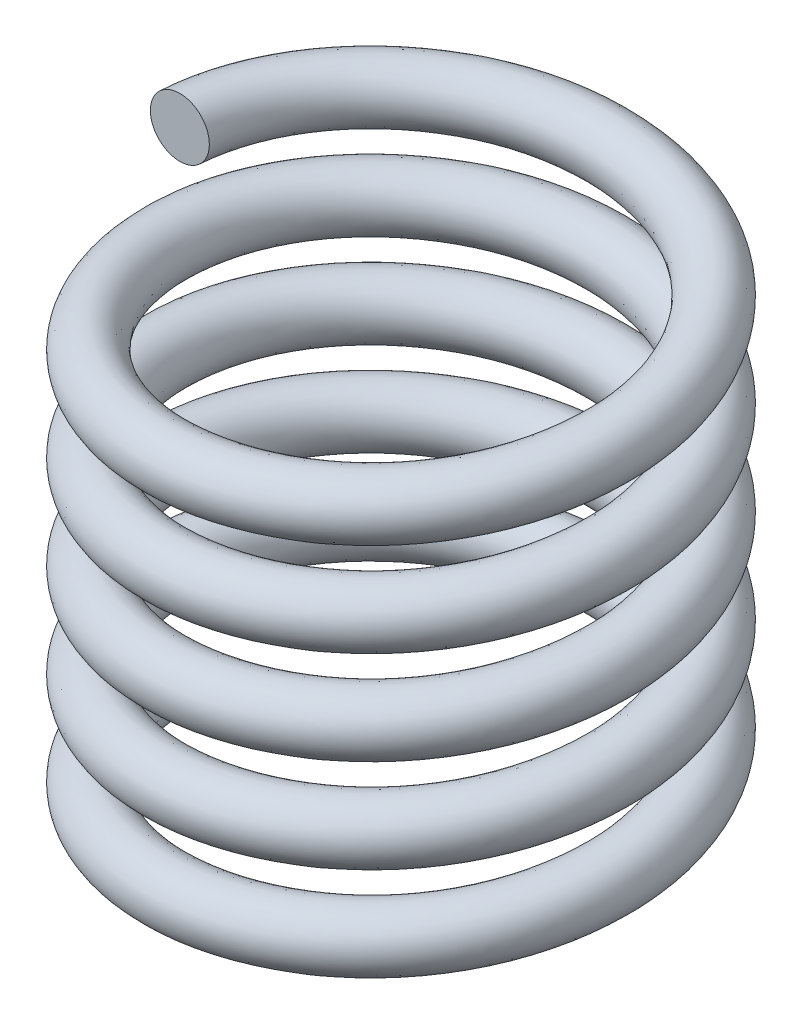
ISO-10303-21;
HEADER;
FILE_DESCRIPTION(('STEP AP214'),'2;1');
FILE_NAME('part.step','',(''),(''),'','','');
FILE_SCHEMA(('AUTOMOTIVE_DESIGN { 1 0 10303 214 1 1 1 1 }'));
ENDSEC;
DATA;
#1=APPLICATION_CONTEXT('core data for automotive mechanical design processes');
#2=APPLICATION_PROTOCOL_DEFINITION('international standard','automotive_design',2000,#1);
#3=PRODUCT_CONTEXT('',#1,'mechanical');
#4=PRODUCT('Part','Part','',(#3));
#5=PRODUCT_RELATED_PRODUCT_CATEGORY('part','',(#4));
#6=PRODUCT_DEFINITION_FORMATION('','',#4);
#7=PRODUCT_DEFINITION_CONTEXT('part definition',#1,'design');
#8=PRODUCT_DEFINITION('design','',#6,#7);
#9=PRODUCT_DEFINITION_SHAPE('','',#8);
#10=(LENGTH_UNIT() NAMED_UNIT(*) SI_UNIT(.MILLI.,.METRE.));
#11=(NAMED_UNIT(*) PLANE_ANGLE_UNIT() SI_UNIT($,.RADIAN.));
#12=(NAMED_UNIT(*) SI_UNIT($,.STERADIAN.) SOLID_ANGLE_UNIT());
#13=UNCERTAINTY_MEASURE_WITH_UNIT(LENGTH_MEASURE(1.E-05),#10,'distance_accuracy_value','');
#14=(GEOMETRIC_REPRESENTATION_CONTEXT(3) GLOBAL_UNCERTAINTY_ASSIGNED_CONTEXT((#13)) GLOBAL_UNIT_ASSIGNED_CONTEXT((#10,
#11,#12)) REPRESENTATION_CONTEXT('',''));
#15=CARTESIAN_POINT('',(0.,0.,0.));
#16=DIRECTION('',(0.,0.,1.));
#17=DIRECTION('',(1.,0.,0.));
#18=AXIS2_PLACEMENT_3D('',#15,#16,#17);
#19=CARTESIAN_POINT('',(-3.,0.,0.));
#20=DIRECTION('',(0.,0.,1.));
#21=DIRECTION('',(1.,0.,0.));
#22=AXIS2_PLACEMENT_3D('',#19,#20,#21);
#23=PLANE('',#22);
#24=CARTESIAN_POINT('',(-3.,0.,0.));
#25=DIRECTION('',(0.,0.,1.));
#26=DIRECTION('',(1.,0.,0.));
#27=AXIS2_PLACEMENT_3D('',#24,#25,#26);
#28=CIRCLE('',#27,0.4);
#29=CARTESIAN_POINT('',(-2.6,0.,0.));
#30=VERTEX_POINT('',#29);
#31=EDGE_CURVE('E40',#30,#30,#28,.T.);
#32=ORIENTED_EDGE('',*,*,#31,.F.);
#33=EDGE_LOOP('',(#32));
#34=FACE_BOUND('',#33,.T.);
#35=ADVANCED_FACE('F33',(#34),#23,.F.);
#36=CARTESIAN_POINT('',(-3.,6.35,2.09488880330588E-13));
#37=DIRECTION('',(0.,0.,1.));
#38=DIRECTION('',(1.,0.,0.));
#39=AXIS2_PLACEMENT_3D('',#36,#37,#38);
#40=PLANE('',#39);
#41=CARTESIAN_POINT('',(-3.,6.35,2.09488880330588E-13));
#42=DIRECTION('',(0.,0.,1.));
#43=DIRECTION('',(1.,0.,0.));
#44=AXIS2_PLACEMENT_3D('',#41,#42,#43);
#45=CIRCLE('',#44,0.4);
#46=CARTESIAN_POINT('',(-2.6,6.35,1.81557029619843E-13));
#47=VERTEX_POINT('',#46);
#48=EDGE_CURVE('E11',#47,#47,#45,.T.);
#49=ORIENTED_EDGE('',*,*,#48,.T.);
#50=EDGE_LOOP('',(#49));
#51=FACE_BOUND('',#50,.T.);
#52=ADVANCED_FACE('F47',(#51),#40,.T.);
#53=CARTESIAN_POINT('',(-2.6,0.,0.));
#54=CARTESIAN_POINT('',(-2.6,0.105833333333333,1.50111069989303));
#55=CARTESIAN_POINT('',(-1.3,0.211666666666666,2.25166604983954));
#56=CARTESIAN_POINT('',(0.,0.317499999999999,3.00222139978605));
#57=CARTESIAN_POINT('',(1.3,0.423333333333332,2.25166604983954));
#58=CARTESIAN_POINT('',(2.6,0.529166666666665,1.50111069989303));
#59=CARTESIAN_POINT('',(2.6,0.634999999999998,0.));
#60=CARTESIAN_POINT('',(2.6,0.740833333333331,-1.50111069989303));
#61=CARTESIAN_POINT('',(1.3,0.846666666666664,-2.25166604983954));
#62=CARTESIAN_POINT('',(0.,0.952499999999997,-3.00222139978605));
#63=CARTESIAN_POINT('',(-1.3,1.05833333333333,-2.25166604983954));
#64=CARTESIAN_POINT('',(-2.6,1.16416666666666,-1.50111069989303));
#65=CARTESIAN_POINT('',(-2.6,1.27,0.));
#66=CARTESIAN_POINT('',(-2.6,1.37583333333333,1.50111069989303));
#67=CARTESIAN_POINT('',(-1.3,1.48166666666666,2.25166604983954));
#68=CARTESIAN_POINT('',(0.,1.5875,3.00222139978605));
#69=CARTESIAN_POINT('',(1.3,1.69333333333333,2.25166604983954));
#70=CARTESIAN_POINT('',(2.6,1.79916666666666,1.50111069989303));
#71=CARTESIAN_POINT('',(2.6,1.90499999999999,0.));
#72=CARTESIAN_POINT('',(2.6,2.01083333333333,-1.50111069989303));
#73=CARTESIAN_POINT('',(1.3,2.11666666666666,-2.25166604983954));
#74=CARTESIAN_POINT('',(0.,2.22249999999999,-3.00222139978605));
#75=CARTESIAN_POINT('',(-1.3,2.32833333333333,-2.25166604983954));
#76=CARTESIAN_POINT('',(-2.6,2.43416666666666,-1.50111069989303));
#77=CARTESIAN_POINT('',(-2.6,2.53999999999999,0.));
#78=CARTESIAN_POINT('',(-2.6,2.64583333333333,1.50111069989303));
#79=CARTESIAN_POINT('',(-1.3,2.75166666666666,2.25166604983954));
#80=CARTESIAN_POINT('',(0.,2.85749999999999,3.00222139978605));
#81=CARTESIAN_POINT('',(1.3,2.96333333333333,2.25166604983954));
#82=CARTESIAN_POINT('',(2.6,3.06916666666666,1.50111069989303));
#83=CARTESIAN_POINT('',(2.6,3.17499999999999,0.));
#84=CARTESIAN_POINT('',(2.6,3.28083333333332,-1.50111069989303));
#85=CARTESIAN_POINT('',(1.3,3.38666666666666,-2.25166604983954));
#86=CARTESIAN_POINT('',(0.,3.49249999999999,-3.00222139978605));
#87=CARTESIAN_POINT('',(-1.3,3.59833333333332,-2.25166604983954));
#88=CARTESIAN_POINT('',(-2.6,3.70416666666666,-1.50111069989303));
#89=CARTESIAN_POINT('',(-2.6,3.80999999999999,0.));
#90=CARTESIAN_POINT('',(-2.6,3.91583333333332,1.50111069989303));
#91=CARTESIAN_POINT('',(-1.3,4.02166666666665,2.25166604983954));
#92=CARTESIAN_POINT('',(0.,4.12749999999999,3.00222139978605));
#93=CARTESIAN_POINT('',(1.3,4.23333333333332,2.25166604983954));
#94=CARTESIAN_POINT('',(2.6,4.33916666666665,1.50111069989303));
#95=CARTESIAN_POINT('',(2.6,4.44499999999999,0.));
#96=CARTESIAN_POINT('',(2.6,4.55083333333332,-1.50111069989303));
#97=CARTESIAN_POINT('',(1.3,4.65666666666665,-2.25166604983954));
#98=CARTESIAN_POINT('',(0.,4.76249999999999,-3.00222139978605));
#99=CARTESIAN_POINT('',(-1.3,4.86833333333332,-2.25166604983954));
#100=CARTESIAN_POINT('',(-2.6,4.97416666666665,-1.50111069989303));
#101=CARTESIAN_POINT('',(-2.6,5.07999999999999,0.));
#102=CARTESIAN_POINT('',(-2.6,5.18583333333332,1.50111069989303));
#103=CARTESIAN_POINT('',(-1.3,5.29166666666665,2.25166604983954));
#104=CARTESIAN_POINT('',(0.,5.39749999999999,3.00222139978605));
#105=CARTESIAN_POINT('',(1.3,5.50333333333332,2.25166604983954));
#106=CARTESIAN_POINT('',(2.6,5.60916666666665,1.50111069989303));
#107=CARTESIAN_POINT('',(2.6,5.71499999999998,0.));
#108=CARTESIAN_POINT('',(2.6,5.82083333333332,-1.50111069989303));
#109=CARTESIAN_POINT('',(1.3,5.92666666666665,-2.25166604983954));
#110=CARTESIAN_POINT('',(0.,6.03249999999998,-3.00222139978605));
#111=CARTESIAN_POINT('',(-1.3,6.13833333333332,-2.25166604983954));
#112=CARTESIAN_POINT('',(-2.6,6.24416666666665,-1.50111069989303));
#113=CARTESIAN_POINT('',(-2.6,6.34999999999998,0.));
#114=CARTESIAN_POINT('',(-2.6,0.800000000000001,0.));
#115=CARTESIAN_POINT('',(-2.6,0.905833333333334,1.50111069989303));
#116=CARTESIAN_POINT('',(-1.3,1.01166666666667,2.25166604983954));
#117=CARTESIAN_POINT('',(0.,1.1175,3.00222139978605));
#118=CARTESIAN_POINT('',(1.3,1.22333333333333,2.25166604983954));
#119=CARTESIAN_POINT('',(2.6,1.32916666666667,1.50111069989303));
#120=CARTESIAN_POINT('',(2.6,1.435,0.));
#121=CARTESIAN_POINT('',(2.6,1.54083333333333,-1.50111069989303));
#122=CARTESIAN_POINT('',(1.3,1.64666666666666,-2.25166604983954));
#123=CARTESIAN_POINT('',(0.,1.7525,-3.00222139978605));
#124=CARTESIAN_POINT('',(-1.3,1.85833333333333,-2.25166604983954));
#125=CARTESIAN_POINT('',(-2.6,1.96416666666666,-1.50111069989303));
#126=CARTESIAN_POINT('',(-2.6,2.07,0.));
#127=CARTESIAN_POINT('',(-2.6,2.17583333333333,1.50111069989303));
#128=CARTESIAN_POINT('',(-1.3,2.28166666666666,2.25166604983954));
#129=CARTESIAN_POINT('',(0.,2.3875,3.00222139978605));
#130=CARTESIAN_POINT('',(1.3,2.49333333333333,2.25166604983954));
#131=CARTESIAN_POINT('',(2.6,2.59916666666666,1.50111069989303));
#132=CARTESIAN_POINT('',(2.6,2.705,0.));
#133=CARTESIAN_POINT('',(2.6,2.81083333333333,-1.50111069989303));
#134=CARTESIAN_POINT('',(1.3,2.91666666666666,-2.25166604983954));
#135=CARTESIAN_POINT('',(0.,3.0225,-3.00222139978605));
#136=CARTESIAN_POINT('',(-1.3,3.12833333333333,-2.25166604983954));
#137=CARTESIAN_POINT('',(-2.6,3.23416666666666,-1.50111069989303));
#138=CARTESIAN_POINT('',(-2.6,3.33999999999999,0.));
#139=CARTESIAN_POINT('',(-2.6,3.44583333333333,1.50111069989303));
#140=CARTESIAN_POINT('',(-1.3,3.55166666666666,2.25166604983954));
#141=CARTESIAN_POINT('',(0.,3.65749999999999,3.00222139978605));
#142=CARTESIAN_POINT('',(1.3,3.76333333333333,2.25166604983954));
#143=CARTESIAN_POINT('',(2.6,3.86916666666666,1.50111069989303));
#144=CARTESIAN_POINT('',(2.6,3.97499999999999,0.));
#145=CARTESIAN_POINT('',(2.6,4.08083333333333,-1.50111069989303));
#146=CARTESIAN_POINT('',(1.3,4.18666666666666,-2.25166604983954));
#147=CARTESIAN_POINT('',(0.,4.29249999999999,-3.00222139978605));
#148=CARTESIAN_POINT('',(-1.3,4.39833333333332,-2.25166604983954));
#149=CARTESIAN_POINT('',(-2.6,4.50416666666666,-1.50111069989303));
#150=CARTESIAN_POINT('',(-2.6,4.60999999999999,0.));
#151=CARTESIAN_POINT('',(-2.6,4.71583333333332,1.50111069989303));
#152=CARTESIAN_POINT('',(-1.3,4.82166666666666,2.25166604983954));
#153=CARTESIAN_POINT('',(0.,4.92749999999999,3.00222139978605));
#154=CARTESIAN_POINT('',(1.3,5.03333333333332,2.25166604983954));
#155=CARTESIAN_POINT('',(2.6,5.13916666666666,1.50111069989303));
#156=CARTESIAN_POINT('',(2.6,5.24499999999999,0.));
#157=CARTESIAN_POINT('',(2.6,5.35083333333332,-1.50111069989303));
#158=CARTESIAN_POINT('',(1.3,5.45666666666665,-2.25166604983954));
#159=CARTESIAN_POINT('',(0.,5.56249999999999,-3.00222139978605));
#160=CARTESIAN_POINT('',(-1.3,5.66833333333332,-2.25166604983954));
#161=CARTESIAN_POINT('',(-2.6,5.77416666666665,-1.50111069989303));
#162=CARTESIAN_POINT('',(-2.6,5.87999999999999,0.));
#163=CARTESIAN_POINT('',(-2.6,5.98583333333332,1.50111069989303));
#164=CARTESIAN_POINT('',(-1.3,6.09166666666665,2.25166604983954));
#165=CARTESIAN_POINT('',(0.,6.19749999999999,3.00222139978605));
#166=CARTESIAN_POINT('',(1.3,6.30333333333332,2.25166604983954));
#167=CARTESIAN_POINT('',(2.6,6.40916666666665,1.50111069989303));
#168=CARTESIAN_POINT('',(2.6,6.51499999999999,0.));
#169=CARTESIAN_POINT('',(2.6,6.62083333333332,-1.50111069989303));
#170=CARTESIAN_POINT('',(1.3,6.72666666666665,-2.25166604983954));
#171=CARTESIAN_POINT('',(0.,6.83249999999999,-3.00222139978605));
#172=CARTESIAN_POINT('',(-1.3,6.93833333333332,-2.25166604983954));
#173=CARTESIAN_POINT('',(-2.6,7.04416666666665,-1.50111069989303));
#174=CARTESIAN_POINT('',(-2.6,7.14999999999998,0.));
#175=CARTESIAN_POINT('',(-3.4,0.800000000000001,0.));
#176=CARTESIAN_POINT('',(-3.4,0.905833333333334,1.96299091524473));
#177=CARTESIAN_POINT('',(-1.7,1.01166666666667,2.94448637286709));
#178=CARTESIAN_POINT('',(0.,1.1175,3.92598183048946));
#179=CARTESIAN_POINT('',(1.7,1.22333333333333,2.94448637286709));
#180=CARTESIAN_POINT('',(3.4,1.32916666666667,1.96299091524473));
#181=CARTESIAN_POINT('',(3.4,1.435,0.));
#182=CARTESIAN_POINT('',(3.4,1.54083333333333,-1.96299091524473));
#183=CARTESIAN_POINT('',(1.7,1.64666666666666,-2.94448637286709));
#184=CARTESIAN_POINT('',(0.,1.7525,-3.92598183048946));
#185=CARTESIAN_POINT('',(-1.7,1.85833333333333,-2.94448637286709));
#186=CARTESIAN_POINT('',(-3.4,1.96416666666666,-1.96299091524473));
#187=CARTESIAN_POINT('',(-3.4,2.07,0.));
#188=CARTESIAN_POINT('',(-3.4,2.17583333333333,1.96299091524473));
#189=CARTESIAN_POINT('',(-1.7,2.28166666666666,2.94448637286709));
#190=CARTESIAN_POINT('',(0.,2.3875,3.92598183048946));
#191=CARTESIAN_POINT('',(1.7,2.49333333333333,2.94448637286709));
#192=CARTESIAN_POINT('',(3.4,2.59916666666666,1.96299091524473));
#193=CARTESIAN_POINT('',(3.4,2.705,0.));
#194=CARTESIAN_POINT('',(3.4,2.81083333333333,-1.96299091524473));
#195=CARTESIAN_POINT('',(1.7,2.91666666666666,-2.94448637286709));
#196=CARTESIAN_POINT('',(0.,3.0225,-3.92598183048946));
#197=CARTESIAN_POINT('',(-1.7,3.12833333333333,-2.94448637286709));
#198=CARTESIAN_POINT('',(-3.4,3.23416666666666,-1.96299091524473));
#199=CARTESIAN_POINT('',(-3.4,3.33999999999999,0.));
#200=CARTESIAN_POINT('',(-3.4,3.44583333333333,1.96299091524473));
#201=CARTESIAN_POINT('',(-1.7,3.55166666666666,2.94448637286709));
#202=CARTESIAN_POINT('',(0.,3.65749999999999,3.92598183048946));
#203=CARTESIAN_POINT('',(1.7,3.76333333333333,2.94448637286709));
#204=CARTESIAN_POINT('',(3.4,3.86916666666666,1.96299091524473));
#205=CARTESIAN_POINT('',(3.4,3.97499999999999,0.));
#206=CARTESIAN_POINT('',(3.4,4.08083333333333,-1.96299091524473));
#207=CARTESIAN_POINT('',(1.7,4.18666666666666,-2.94448637286709));
#208=CARTESIAN_POINT('',(0.,4.29249999999999,-3.92598183048946));
#209=CARTESIAN_POINT('',(-1.7,4.39833333333332,-2.94448637286709));
#210=CARTESIAN_POINT('',(-3.4,4.50416666666666,-1.96299091524473));
#211=CARTESIAN_POINT('',(-3.4,4.60999999999999,0.));
#212=CARTESIAN_POINT('',(-3.4,4.71583333333332,1.96299091524473));
#213=CARTESIAN_POINT('',(-1.7,4.82166666666666,2.94448637286709));
#214=CARTESIAN_POINT('',(0.,4.92749999999999,3.92598183048946));
#215=CARTESIAN_POINT('',(1.7,5.03333333333332,2.94448637286709));
#216=CARTESIAN_POINT('',(3.4,5.13916666666666,1.96299091524473));
#217=CARTESIAN_POINT('',(3.4,5.24499999999999,0.));
#218=CARTESIAN_POINT('',(3.4,5.35083333333332,-1.96299091524473));
#219=CARTESIAN_POINT('',(1.7,5.45666666666665,-2.94448637286709));
#220=CARTESIAN_POINT('',(0.,5.56249999999999,-3.92598183048946));
#221=CARTESIAN_POINT('',(-1.7,5.66833333333332,-2.94448637286709));
#222=CARTESIAN_POINT('',(-3.4,5.77416666666665,-1.96299091524473));
#223=CARTESIAN_POINT('',(-3.4,5.87999999999999,0.));
#224=CARTESIAN_POINT('',(-3.4,5.98583333333332,1.96299091524473));
#225=CARTESIAN_POINT('',(-1.7,6.09166666666665,2.94448637286709));
#226=CARTESIAN_POINT('',(0.,6.19749999999999,3.92598183048946));
#227=CARTESIAN_POINT('',(1.7,6.30333333333332,2.94448637286709));
#228=CARTESIAN_POINT('',(3.4,6.40916666666665,1.96299091524473));
#229=CARTESIAN_POINT('',(3.4,6.51499999999999,0.));
#230=CARTESIAN_POINT('',(3.4,6.62083333333332,-1.96299091524473));
#231=CARTESIAN_POINT('',(1.7,6.72666666666665,-2.94448637286709));
#232=CARTESIAN_POINT('',(0.,6.83249999999999,-3.92598183048946));
#233=CARTESIAN_POINT('',(-1.7,6.93833333333332,-2.94448637286709));
#234=CARTESIAN_POINT('',(-3.4,7.04416666666665,-1.96299091524473));
#235=CARTESIAN_POINT('',(-3.4,7.14999999999998,0.));
#236=CARTESIAN_POINT('',(-3.4,0.,0.));
#237=CARTESIAN_POINT('',(-3.4,0.105833333333333,1.96299091524473));
#238=CARTESIAN_POINT('',(-1.7,0.211666666666666,2.94448637286709));
#239=CARTESIAN_POINT('',(0.,0.317499999999999,3.92598183048946));
#240=CARTESIAN_POINT('',(1.7,0.423333333333332,2.94448637286709));
#241=CARTESIAN_POINT('',(3.4,0.529166666666665,1.96299091524473));
#242=CARTESIAN_POINT('',(3.4,0.634999999999998,0.));
#243=CARTESIAN_POINT('',(3.4,0.740833333333331,-1.96299091524473));
#244=CARTESIAN_POINT('',(1.7,0.846666666666664,-2.94448637286709));
#245=CARTESIAN_POINT('',(0.,0.952499999999997,-3.92598183048946));
#246=CARTESIAN_POINT('',(-1.7,1.05833333333333,-2.94448637286709));
#247=CARTESIAN_POINT('',(-3.4,1.16416666666666,-1.96299091524473));
#248=CARTESIAN_POINT('',(-3.4,1.27,0.));
#249=CARTESIAN_POINT('',(-3.4,1.37583333333333,1.96299091524473));
#250=CARTESIAN_POINT('',(-1.7,1.48166666666666,2.94448637286709));
#251=CARTESIAN_POINT('',(0.,1.5875,3.92598183048946));
#252=CARTESIAN_POINT('',(1.7,1.69333333333333,2.94448637286709));
#253=CARTESIAN_POINT('',(3.4,1.79916666666666,1.96299091524473));
#254=CARTESIAN_POINT('',(3.4,1.90499999999999,0.));
#255=CARTESIAN_POINT('',(3.4,2.01083333333333,-1.96299091524473));
#256=CARTESIAN_POINT('',(1.7,2.11666666666666,-2.94448637286709));
#257=CARTESIAN_POINT('',(0.,2.22249999999999,-3.92598183048946));
#258=CARTESIAN_POINT('',(-1.7,2.32833333333333,-2.94448637286709));
#259=CARTESIAN_POINT('',(-3.4,2.43416666666666,-1.96299091524473));
#260=CARTESIAN_POINT('',(-3.4,2.53999999999999,0.));
#261=CARTESIAN_POINT('',(-3.4,2.64583333333333,1.96299091524473));
#262=CARTESIAN_POINT('',(-1.7,2.75166666666666,2.94448637286709));
#263=CARTESIAN_POINT('',(0.,2.85749999999999,3.92598183048946));
#264=CARTESIAN_POINT('',(1.7,2.96333333333333,2.94448637286709));
#265=CARTESIAN_POINT('',(3.4,3.06916666666666,1.96299091524473));
#266=CARTESIAN_POINT('',(3.4,3.17499999999999,0.));
#267=CARTESIAN_POINT('',(3.4,3.28083333333332,-1.96299091524473));
#268=CARTESIAN_POINT('',(1.7,3.38666666666666,-2.94448637286709));
#269=CARTESIAN_POINT('',(0.,3.49249999999999,-3.92598183048946));
#270=CARTESIAN_POINT('',(-1.7,3.59833333333332,-2.94448637286709));
#271=CARTESIAN_POINT('',(-3.4,3.70416666666666,-1.96299091524473));
#272=CARTESIAN_POINT('',(-3.4,3.80999999999999,0.));
#273=CARTESIAN_POINT('',(-3.4,3.91583333333332,1.96299091524473));
#274=CARTESIAN_POINT('',(-1.7,4.02166666666665,2.94448637286709));
#275=CARTESIAN_POINT('',(0.,4.12749999999999,3.92598183048946));
#276=CARTESIAN_POINT('',(1.7,4.23333333333332,2.94448637286709));
#277=CARTESIAN_POINT('',(3.4,4.33916666666665,1.96299091524473));
#278=CARTESIAN_POINT('',(3.4,4.44499999999999,0.));
#279=CARTESIAN_POINT('',(3.4,4.55083333333332,-1.96299091524473));
#280=CARTESIAN_POINT('',(1.7,4.65666666666665,-2.94448637286709));
#281=CARTESIAN_POINT('',(0.,4.76249999999999,-3.92598183048946));
#282=CARTESIAN_POINT('',(-1.7,4.86833333333332,-2.94448637286709));
#283=CARTESIAN_POINT('',(-3.4,4.97416666666665,-1.96299091524473));
#284=CARTESIAN_POINT('',(-3.4,5.07999999999999,0.));
#285=CARTESIAN_POINT('',(-3.4,5.18583333333332,1.96299091524473));
#286=CARTESIAN_POINT('',(-1.7,5.29166666666665,2.94448637286709));
#287=CARTESIAN_POINT('',(0.,5.39749999999999,3.92598183048946));
#288=CARTESIAN_POINT('',(1.7,5.50333333333332,2.94448637286709));
#289=CARTESIAN_POINT('',(3.4,5.60916666666665,1.96299091524473));
#290=CARTESIAN_POINT('',(3.4,5.71499999999998,0.));
#291=CARTESIAN_POINT('',(3.4,5.82083333333332,-1.96299091524473));
#292=CARTESIAN_POINT('',(1.7,5.92666666666665,-2.94448637286709));
#293=CARTESIAN_POINT('',(0.,6.03249999999998,-3.92598183048946));
#294=CARTESIAN_POINT('',(-1.7,6.13833333333332,-2.94448637286709));
#295=CARTESIAN_POINT('',(-3.4,6.24416666666665,-1.96299091524473));
#296=CARTESIAN_POINT('',(-3.4,6.34999999999998,0.));
#297=CARTESIAN_POINT('',(-3.4,-0.800000000000001,0.));
#298=CARTESIAN_POINT('',(-3.4,-0.694166666666668,1.96299091524473));
#299=CARTESIAN_POINT('',(-1.7,-0.588333333333335,2.94448637286709));
#300=CARTESIAN_POINT('',(0.,-0.482500000000001,3.92598183048946));
#301=CARTESIAN_POINT('',(1.7,-0.376666666666668,2.94448637286709));
#302=CARTESIAN_POINT('',(3.4,-0.270833333333335,1.96299091524473));
#303=CARTESIAN_POINT('',(3.4,-0.165000000000002,0.));
#304=CARTESIAN_POINT('',(3.4,-0.0591666666666691,-1.96299091524473));
#305=CARTESIAN_POINT('',(1.7,0.0466666666666639,-2.94448637286709));
#306=CARTESIAN_POINT('',(0.,0.152499999999997,-3.92598183048946));
#307=CARTESIAN_POINT('',(-1.7,0.25833333333333,-2.94448637286709));
#308=CARTESIAN_POINT('',(-3.4,0.364166666666663,-1.96299091524473));
#309=CARTESIAN_POINT('',(-3.4,0.469999999999996,0.));
#310=CARTESIAN_POINT('',(-3.4,0.575833333333329,1.96299091524473));
#311=CARTESIAN_POINT('',(-1.7,0.681666666666662,2.94448637286709));
#312=CARTESIAN_POINT('',(0.,0.787499999999995,3.92598183048946));
#313=CARTESIAN_POINT('',(1.7,0.893333333333328,2.94448637286709));
#314=CARTESIAN_POINT('',(3.4,0.999166666666661,1.96299091524473));
#315=CARTESIAN_POINT('',(3.4,1.10499999999999,0.));
#316=CARTESIAN_POINT('',(3.4,1.21083333333333,-1.96299091524473));
#317=CARTESIAN_POINT('',(1.7,1.31666666666666,-2.94448637286709));
#318=CARTESIAN_POINT('',(0.,1.42249999999999,-3.92598183048946));
#319=CARTESIAN_POINT('',(-1.7,1.52833333333333,-2.94448637286709));
#320=CARTESIAN_POINT('',(-3.4,1.63416666666666,-1.96299091524473));
#321=CARTESIAN_POINT('',(-3.4,1.73999999999999,0.));
#322=CARTESIAN_POINT('',(-3.4,1.84583333333333,1.96299091524473));
#323=CARTESIAN_POINT('',(-1.7,1.95166666666666,2.94448637286709));
#324=CARTESIAN_POINT('',(0.,2.05749999999999,3.92598183048946));
#325=CARTESIAN_POINT('',(1.7,2.16333333333332,2.94448637286709));
#326=CARTESIAN_POINT('',(3.4,2.26916666666666,1.96299091524473));
#327=CARTESIAN_POINT('',(3.4,2.37499999999999,0.));
#328=CARTESIAN_POINT('',(3.4,2.48083333333332,-1.96299091524473));
#329=CARTESIAN_POINT('',(1.7,2.58666666666666,-2.94448637286709));
#330=CARTESIAN_POINT('',(0.,2.69249999999999,-3.92598183048946));
#331=CARTESIAN_POINT('',(-1.7,2.79833333333332,-2.94448637286709));
#332=CARTESIAN_POINT('',(-3.4,2.90416666666666,-1.96299091524473));
#333=CARTESIAN_POINT('',(-3.4,3.00999999999999,0.));
#334=CARTESIAN_POINT('',(-3.4,3.11583333333332,1.96299091524473));
#335=CARTESIAN_POINT('',(-1.7,3.22166666666665,2.94448637286709));
#336=CARTESIAN_POINT('',(0.,3.32749999999999,3.92598183048946));
#337=CARTESIAN_POINT('',(1.7,3.43333333333332,2.94448637286709));
#338=CARTESIAN_POINT('',(3.4,3.53916666666665,1.96299091524473));
#339=CARTESIAN_POINT('',(3.4,3.64499999999999,0.));
#340=CARTESIAN_POINT('',(3.4,3.75083333333332,-1.96299091524473));
#341=CARTESIAN_POINT('',(1.7,3.85666666666665,-2.94448637286709));
#342=CARTESIAN_POINT('',(0.,3.96249999999999,-3.92598183048946));
#343=CARTESIAN_POINT('',(-1.7,4.06833333333332,-2.94448637286709));
#344=CARTESIAN_POINT('',(-3.4,4.17416666666665,-1.96299091524473));
#345=CARTESIAN_POINT('',(-3.4,4.27999999999999,0.));
#346=CARTESIAN_POINT('',(-3.4,4.38583333333332,1.96299091524473));
#347=CARTESIAN_POINT('',(-1.7,4.49166666666665,2.94448637286709));
#348=CARTESIAN_POINT('',(0.,4.59749999999999,3.92598183048946));
#349=CARTESIAN_POINT('',(1.7,4.70333333333332,2.94448637286709));
#350=CARTESIAN_POINT('',(3.4,4.80916666666665,1.96299091524473));
#351=CARTESIAN_POINT('',(3.4,4.91499999999998,0.));
#352=CARTESIAN_POINT('',(3.4,5.02083333333332,-1.96299091524473));
#353=CARTESIAN_POINT('',(1.7,5.12666666666665,-2.94448637286709));
#354=CARTESIAN_POINT('',(0.,5.23249999999998,-3.92598183048946));
#355=CARTESIAN_POINT('',(-1.7,5.33833333333332,-2.94448637286709));
#356=CARTESIAN_POINT('',(-3.4,5.44416666666665,-1.96299091524473));
#357=CARTESIAN_POINT('',(-3.4,5.54999999999998,0.));
#358=CARTESIAN_POINT('',(-2.6,-0.800000000000001,0.));
#359=CARTESIAN_POINT('',(-2.6,-0.694166666666668,1.50111069989303));
#360=CARTESIAN_POINT('',(-1.3,-0.588333333333335,2.25166604983954));
#361=CARTESIAN_POINT('',(0.,-0.482500000000001,3.00222139978605));
#362=CARTESIAN_POINT('',(1.3,-0.376666666666668,2.25166604983954));
#363=CARTESIAN_POINT('',(2.6,-0.270833333333335,1.50111069989303));
#364=CARTESIAN_POINT('',(2.6,-0.165000000000002,0.));
#365=CARTESIAN_POINT('',(2.6,-0.0591666666666691,-1.50111069989303));
#366=CARTESIAN_POINT('',(1.3,0.0466666666666639,-2.25166604983954));
#367=CARTESIAN_POINT('',(0.,0.152499999999997,-3.00222139978605));
#368=CARTESIAN_POINT('',(-1.3,0.25833333333333,-2.25166604983954));
#369=CARTESIAN_POINT('',(-2.6,0.364166666666663,-1.50111069989303));
#370=CARTESIAN_POINT('',(-2.6,0.469999999999996,0.));
#371=CARTESIAN_POINT('',(-2.6,0.575833333333329,1.50111069989303));
#372=CARTESIAN_POINT('',(-1.3,0.681666666666662,2.25166604983954));
#373=CARTESIAN_POINT('',(0.,0.787499999999995,3.00222139978605));
#374=CARTESIAN_POINT('',(1.3,0.893333333333328,2.25166604983954));
#375=CARTESIAN_POINT('',(2.6,0.999166666666661,1.50111069989303));
#376=CARTESIAN_POINT('',(2.6,1.10499999999999,0.));
#377=CARTESIAN_POINT('',(2.6,1.21083333333333,-1.50111069989303));
#378=CARTESIAN_POINT('',(1.3,1.31666666666666,-2.25166604983954));
#379=CARTESIAN_POINT('',(0.,1.42249999999999,-3.00222139978605));
#380=CARTESIAN_POINT('',(-1.3,1.52833333333333,-2.25166604983954));
#381=CARTESIAN_POINT('',(-2.6,1.63416666666666,-1.50111069989303));
#382=CARTESIAN_POINT('',(-2.6,1.73999999999999,0.));
#383=CARTESIAN_POINT('',(-2.6,1.84583333333333,1.50111069989303));
#384=CARTESIAN_POINT('',(-1.3,1.95166666666666,2.25166604983954));
#385=CARTESIAN_POINT('',(0.,2.05749999999999,3.00222139978605));
#386=CARTESIAN_POINT('',(1.3,2.16333333333332,2.25166604983954));
#387=CARTESIAN_POINT('',(2.6,2.26916666666666,1.50111069989303));
#388=CARTESIAN_POINT('',(2.6,2.37499999999999,0.));
#389=CARTESIAN_POINT('',(2.6,2.48083333333332,-1.50111069989303));
#390=CARTESIAN_POINT('',(1.3,2.58666666666666,-2.25166604983954));
#391=CARTESIAN_POINT('',(0.,2.69249999999999,-3.00222139978605));
#392=CARTESIAN_POINT('',(-1.3,2.79833333333332,-2.25166604983954));
#393=CARTESIAN_POINT('',(-2.6,2.90416666666666,-1.50111069989303));
#394=CARTESIAN_POINT('',(-2.6,3.00999999999999,0.));
#395=CARTESIAN_POINT('',(-2.6,3.11583333333332,1.50111069989303));
#396=CARTESIAN_POINT('',(-1.3,3.22166666666665,2.25166604983954));
#397=CARTESIAN_POINT('',(0.,3.32749999999999,3.00222139978605));
#398=CARTESIAN_POINT('',(1.3,3.43333333333332,2.25166604983954));
#399=CARTESIAN_POINT('',(2.6,3.53916666666665,1.50111069989303));
#400=CARTESIAN_POINT('',(2.6,3.64499999999999,0.));
#401=CARTESIAN_POINT('',(2.6,3.75083333333332,-1.50111069989303));
#402=CARTESIAN_POINT('',(1.3,3.85666666666665,-2.25166604983954));
#403=CARTESIAN_POINT('',(0.,3.96249999999999,-3.00222139978605));
#404=CARTESIAN_POINT('',(-1.3,4.06833333333332,-2.25166604983954));
#405=CARTESIAN_POINT('',(-2.6,4.17416666666665,-1.50111069989303));
#406=CARTESIAN_POINT('',(-2.6,4.27999999999999,0.));
#407=CARTESIAN_POINT('',(-2.6,4.38583333333332,1.50111069989303));
#408=CARTESIAN_POINT('',(-1.3,4.49166666666665,2.25166604983954));
#409=CARTESIAN_POINT('',(0.,4.59749999999999,3.00222139978605));
#410=CARTESIAN_POINT('',(1.3,4.70333333333332,2.25166604983954));
#411=CARTESIAN_POINT('',(2.6,4.80916666666665,1.50111069989303));
#412=CARTESIAN_POINT('',(2.6,4.91499999999998,0.));
#413=CARTESIAN_POINT('',(2.6,5.02083333333332,-1.50111069989303));
#414=CARTESIAN_POINT('',(1.3,5.12666666666665,-2.25166604983954));
#415=CARTESIAN_POINT('',(0.,5.23249999999998,-3.00222139978605));
#416=CARTESIAN_POINT('',(-1.3,5.33833333333332,-2.25166604983954));
#417=CARTESIAN_POINT('',(-2.6,5.44416666666665,-1.50111069989303));
#418=CARTESIAN_POINT('',(-2.6,5.54999999999998,0.));
#419=CARTESIAN_POINT('',(-2.6,0.,0.));
#420=CARTESIAN_POINT('',(-2.6,0.105833333333333,1.50111069989303));
#421=CARTESIAN_POINT('',(-1.3,0.211666666666666,2.25166604983954));
#422=CARTESIAN_POINT('',(0.,0.317499999999999,3.00222139978605));
#423=CARTESIAN_POINT('',(1.3,0.423333333333332,2.25166604983954));
#424=CARTESIAN_POINT('',(2.6,0.529166666666665,1.50111069989303));
#425=CARTESIAN_POINT('',(2.6,0.634999999999998,0.));
#426=CARTESIAN_POINT('',(2.6,0.740833333333331,-1.50111069989303));
#427=CARTESIAN_POINT('',(1.3,0.846666666666664,-2.25166604983954));
#428=CARTESIAN_POINT('',(0.,0.952499999999997,-3.00222139978605));
#429=CARTESIAN_POINT('',(-1.3,1.05833333333333,-2.25166604983954));
#430=CARTESIAN_POINT('',(-2.6,1.16416666666666,-1.50111069989303));
#431=CARTESIAN_POINT('',(-2.6,1.27,0.));
#432=CARTESIAN_POINT('',(-2.6,1.37583333333333,1.50111069989303));
#433=CARTESIAN_POINT('',(-1.3,1.48166666666666,2.25166604983954));
#434=CARTESIAN_POINT('',(0.,1.5875,3.00222139978605));
#435=CARTESIAN_POINT('',(1.3,1.69333333333333,2.25166604983954));
#436=CARTESIAN_POINT('',(2.6,1.79916666666666,1.50111069989303));
#437=CARTESIAN_POINT('',(2.6,1.90499999999999,0.));
#438=CARTESIAN_POINT('',(2.6,2.01083333333333,-1.50111069989303));
#439=CARTESIAN_POINT('',(1.3,2.11666666666666,-2.25166604983954));
#440=CARTESIAN_POINT('',(0.,2.22249999999999,-3.00222139978605));
#441=CARTESIAN_POINT('',(-1.3,2.32833333333333,-2.25166604983954));
#442=CARTESIAN_POINT('',(-2.6,2.43416666666666,-1.50111069989303));
#443=CARTESIAN_POINT('',(-2.6,2.53999999999999,0.));
#444=CARTESIAN_POINT('',(-2.6,2.64583333333333,1.50111069989303));
#445=CARTESIAN_POINT('',(-1.3,2.75166666666666,2.25166604983954));
#446=CARTESIAN_POINT('',(0.,2.85749999999999,3.00222139978605));
#447=CARTESIAN_POINT('',(1.3,2.96333333333333,2.25166604983954));
#448=CARTESIAN_POINT('',(2.6,3.06916666666666,1.50111069989303));
#449=CARTESIAN_POINT('',(2.6,3.17499999999999,0.));
#450=CARTESIAN_POINT('',(2.6,3.28083333333332,-1.50111069989303));
#451=CARTESIAN_POINT('',(1.3,3.38666666666666,-2.25166604983954));
#452=CARTESIAN_POINT('',(0.,3.49249999999999,-3.00222139978605));
#453=CARTESIAN_POINT('',(-1.3,3.59833333333332,-2.25166604983954));
#454=CARTESIAN_POINT('',(-2.6,3.70416666666666,-1.50111069989303));
#455=CARTESIAN_POINT('',(-2.6,3.80999999999999,0.));
#456=CARTESIAN_POINT('',(-2.6,3.91583333333332,1.50111069989303));
#457=CARTESIAN_POINT('',(-1.3,4.02166666666665,2.25166604983954));
#458=CARTESIAN_POINT('',(0.,4.12749999999999,3.00222139978605));
#459=CARTESIAN_POINT('',(1.3,4.23333333333332,2.25166604983954));
#460=CARTESIAN_POINT('',(2.6,4.33916666666665,1.50111069989303));
#461=CARTESIAN_POINT('',(2.6,4.44499999999999,0.));
#462=CARTESIAN_POINT('',(2.6,4.55083333333332,-1.50111069989303));
#463=CARTESIAN_POINT('',(1.3,4.65666666666665,-2.25166604983954));
#464=CARTESIAN_POINT('',(0.,4.76249999999999,-3.00222139978605));
#465=CARTESIAN_POINT('',(-1.3,4.86833333333332,-2.25166604983954));
#466=CARTESIAN_POINT('',(-2.6,4.97416666666665,-1.50111069989303));
#467=CARTESIAN_POINT('',(-2.6,5.07999999999999,0.));
#468=CARTESIAN_POINT('',(-2.6,5.18583333333332,1.50111069989303));
#469=CARTESIAN_POINT('',(-1.3,5.29166666666665,2.25166604983954));
#470=CARTESIAN_POINT('',(0.,5.39749999999999,3.00222139978605));
#471=CARTESIAN_POINT('',(1.3,5.50333333333332,2.25166604983954));
#472=CARTESIAN_POINT('',(2.6,5.60916666666665,1.50111069989303));
#473=CARTESIAN_POINT('',(2.6,5.71499999999998,0.));
#474=CARTESIAN_POINT('',(2.6,5.82083333333332,-1.50111069989303));
#475=CARTESIAN_POINT('',(1.3,5.92666666666665,-2.25166604983954));
#476=CARTESIAN_POINT('',(0.,6.03249999999998,-3.00222139978605));
#477=CARTESIAN_POINT('',(-1.3,6.13833333333332,-2.25166604983954));
#478=CARTESIAN_POINT('',(-2.6,6.24416666666665,-1.50111069989303));
#479=CARTESIAN_POINT('',(-2.6,6.34999999999998,0.));
#480=(BOUNDED_SURFACE() B_SPLINE_SURFACE(3,2,((#53,#54,#55,#56,#57,#58,#59,#60,#61,#62,#63,#64,
#65,#66,#67,#68,#69,#70,#71,#72,#73,#74,#75,#76,#77,#78,#79,#80,#81,#82,#83,#84,#85,#86,#87,#88,
#89,#90,#91,#92,#93,#94,#95,#96,#97,#98,#99,#100,#101,#102,#103,#104,#105,#106,#107,#108,#109,
#110,#111,#112,#113),(#114,#115,#116,#117,#118,#119,#120,#121,#122,#123,#124,#125,#126,#127,
#128,#129,#130,#131,#132,#133,#134,#135,#136,#137,#138,#139,#140,#141,#142,#143,#144,#145,#146,
#147,#148,#149,#150,#151,#152,#153,#154,#155,#156,#157,#158,#159,#160,#161,#162,#163,#164,#165,
#166,#167,#168,#169,#170,#171,#172,#173,#174),(#175,#176,#177,#178,#179,#180,#181,#182,#183,
#184,#185,#186,#187,#188,#189,#190,#191,#192,#193,#194,#195,#196,#197,#198,#199,#200,#201,#202,
#203,#204,#205,#206,#207,#208,#209,#210,#211,#212,#213,#214,#215,#216,#217,#218,#219,#220,#221,
#222,#223,#224,#225,#226,#227,#228,#229,#230,#231,#232,#233,#234,#235),(#236,#237,#238,#239,
#240,#241,#242,#243,#244,#245,#246,#247,#248,#249,#250,#251,#252,#253,#254,#255,#256,#257,#258,
#259,#260,#261,#262,#263,#264,#265,#266,#267,#268,#269,#270,#271,#272,#273,#274,#275,#276,#277,
#278,#279,#280,#281,#282,#283,#284,#285,#286,#287,#288,#289,#290,#291,#292,#293,#294,#295,#296),
(#297,#298,#299,#300,#301,#302,#303,#304,#305,#306,#307,#308,#309,#310,#311,#312,#313,#314,#315,
#316,#317,#318,#319,#320,#321,#322,#323,#324,#325,#326,#327,#328,#329,#330,#331,#332,#333,#334,
#335,#336,#337,#338,#339,#340,#341,#342,#343,#344,#345,#346,#347,#348,#349,#350,#351,#352,#353,
#354,#355,#356,#357),(#358,#359,#360,#361,#362,#363,#364,#365,#366,#367,#368,#369,#370,#371,
#372,#373,#374,#375,#376,#377,#378,#379,#380,#381,#382,#383,#384,#385,#386,#387,#388,#389,#390,
#391,#392,#393,#394,#395,#396,#397,#398,#399,#400,#401,#402,#403,#404,#405,#406,#407,#408,#409,
#410,#411,#412,#413,#414,#415,#416,#417,#418),(#419,#420,#421,#422,#423,#424,#425,#426,#427,
#428,#429,#430,#431,#432,#433,#434,#435,#436,#437,#438,#439,#440,#441,#442,#443,#444,#445,#446,
#447,#448,#449,#450,#451,#452,#453,#454,#455,#456,#457,#458,#459,#460,#461,#462,#463,#464,#465,
#466,#467,#468,#469,#470,#471,#472,#473,#474,#475,#476,#477,#478,#479)),.UNSPECIFIED.,.T.,.F.,
.F.) B_SPLINE_SURFACE_WITH_KNOTS((4,3,4),(3,2,2,2,2,2,2,2,2,2,2,2,2,2,2,2,2,2,2,2,2,2,2,2,2,2,2,
2,2,2,3),(0.,0.5,1.),(0.,0.0333333333333333,0.0666666666666667,0.1,0.133333333333333,
0.166666666666667,0.2,0.233333333333333,0.266666666666667,0.3,0.333333333333333,
0.366666666666667,0.4,0.433333333333333,0.466666666666667,0.5,0.533333333333333,
0.566666666666667,0.6,0.633333333333333,0.666666666666667,0.7,0.733333333333333,
0.766666666666667,0.8,0.833333333333333,0.866666666666667,0.9,0.933333333333333,
0.966666666666667,1.),
.UNSPECIFIED.) GEOMETRIC_REPRESENTATION_ITEM() RATIONAL_B_SPLINE_SURFACE(((1.,0.866025403784439,
1.,0.866025403784439,1.,0.866025403784439,1.,0.866025403784439,1.,0.866025403784439,1.,
0.866025403784439,1.,0.866025403784439,1.,0.866025403784439,1.,0.866025403784439,1.,
0.866025403784439,1.,0.866025403784439,1.,0.866025403784439,1.,0.866025403784439,1.,
0.866025403784439,1.,0.866025403784439,1.,0.866025403784439,1.,0.866025403784439,1.,
0.866025403784439,1.,0.866025403784439,1.,0.866025403784439,1.,0.866025403784439,1.,
0.866025403784439,1.,0.866025403784439,1.,0.866025403784439,1.,0.866025403784439,1.,
0.866025403784439,1.,0.866025403784439,1.,0.866025403784439,1.,0.866025403784439,1.,
0.866025403784439,1.),(0.333333333333333,0.288675134594813,0.333333333333333,0.288675134594813,
0.333333333333333,0.288675134594813,0.333333333333333,0.288675134594813,0.333333333333333,
0.288675134594813,0.333333333333333,0.288675134594813,0.333333333333333,0.288675134594813,
0.333333333333333,0.288675134594813,0.333333333333333,0.288675134594813,0.333333333333333,
0.288675134594813,0.333333333333333,0.288675134594813,0.333333333333333,0.288675134594813,
0.333333333333333,0.288675134594813,0.333333333333333,0.288675134594813,0.333333333333333,
0.288675134594813,0.333333333333333,0.288675134594813,0.333333333333333,0.288675134594813,
0.333333333333333,0.288675134594813,0.333333333333333,0.288675134594813,0.333333333333333,
0.288675134594813,0.333333333333333,0.288675134594813,0.333333333333333,0.288675134594813,
0.333333333333333,0.288675134594813,0.333333333333333,0.288675134594813,0.333333333333333,
0.288675134594813,0.333333333333333,0.288675134594813,0.333333333333333,0.288675134594813,
0.333333333333333,0.288675134594813,0.333333333333333,0.288675134594813,0.333333333333333,
0.288675134594813,0.333333333333333),(0.333333333333333,0.288675134594813,0.333333333333333,
0.288675134594813,0.333333333333333,0.288675134594813,0.333333333333333,0.288675134594813,
0.333333333333333,0.288675134594813,0.333333333333333,0.288675134594813,0.333333333333333,
0.288675134594813,0.333333333333333,0.288675134594813,0.333333333333333,0.288675134594813,
0.333333333333333,0.288675134594813,0.333333333333333,0.288675134594813,0.333333333333333,
0.288675134594813,0.333333333333333,0.288675134594813,0.333333333333333,0.288675134594813,
0.333333333333333,0.288675134594813,0.333333333333333,0.288675134594813,0.333333333333333,
0.288675134594813,0.333333333333333,0.288675134594813,0.333333333333333,0.288675134594813,
0.333333333333333,0.288675134594813,0.333333333333333,0.288675134594813,0.333333333333333,
0.288675134594813,0.333333333333333,0.288675134594813,0.333333333333333,0.288675134594813,
0.333333333333333,0.288675134594813,0.333333333333333,0.288675134594813,0.333333333333333,
0.288675134594813,0.333333333333333,0.288675134594813,0.333333333333333,0.288675134594813,
0.333333333333333,0.288675134594813,0.333333333333333),(1.,0.866025403784439,1.,
0.866025403784439,1.,0.866025403784439,1.,0.866025403784439,1.,0.866025403784439,1.,
0.866025403784439,1.,0.866025403784439,1.,0.866025403784439,1.,0.866025403784439,1.,
0.866025403784439,1.,0.866025403784439,1.,0.866025403784439,1.,0.866025403784439,1.,
0.866025403784439,1.,0.866025403784439,1.,0.866025403784439,1.,0.866025403784439,1.,
0.866025403784439,1.,0.866025403784439,1.,0.866025403784439,1.,0.866025403784439,1.,
0.866025403784439,1.,0.866025403784439,1.,0.866025403784439,1.,0.866025403784439,1.,
0.866025403784439,1.,0.866025403784439,1.,0.866025403784439,1.,0.866025403784439,1.,
0.866025403784439,1.),(0.333333333333333,0.288675134594813,0.333333333333333,0.288675134594813,
0.333333333333333,0.288675134594813,0.333333333333333,0.288675134594813,0.333333333333333,
0.288675134594813,0.333333333333333,0.288675134594813,0.333333333333333,0.288675134594813,
0.333333333333333,0.288675134594813,0.333333333333333,0.288675134594813,0.333333333333333,
0.288675134594813,0.333333333333333,0.288675134594813,0.333333333333333,0.288675134594813,
0.333333333333333,0.288675134594813,0.333333333333333,0.288675134594813,0.333333333333333,
0.288675134594813,0.333333333333333,0.288675134594813,0.333333333333333,0.288675134594813,
0.333333333333333,0.288675134594813,0.333333333333333,0.288675134594813,0.333333333333333,
0.288675134594813,0.333333333333333,0.288675134594813,0.333333333333333,0.288675134594813,
0.333333333333333,0.288675134594813,0.333333333333333,0.288675134594813,0.333333333333333,
0.288675134594813,0.333333333333333,0.288675134594813,0.333333333333333,0.288675134594813,
0.333333333333333,0.288675134594813,0.333333333333333,0.288675134594813,0.333333333333333,
0.288675134594813,0.333333333333333),(0.333333333333333,0.288675134594813,0.333333333333333,
0.288675134594813,0.333333333333333,0.288675134594813,0.333333333333333,0.288675134594813,
0.333333333333333,0.288675134594813,0.333333333333333,0.288675134594813,0.333333333333333,
0.288675134594813,0.333333333333333,0.288675134594813,0.333333333333333,0.288675134594813,
0.333333333333333,0.288675134594813,0.333333333333333,0.288675134594813,0.333333333333333,
0.288675134594813,0.333333333333333,0.288675134594813,0.333333333333333,0.288675134594813,
0.333333333333333,0.288675134594813,0.333333333333333,0.288675134594813,0.333333333333333,
0.288675134594813,0.333333333333333,0.288675134594813,0.333333333333333,0.288675134594813,
0.333333333333333,0.288675134594813,0.333333333333333,0.288675134594813,0.333333333333333,
0.288675134594813,0.333333333333333,0.288675134594813,0.333333333333333,0.288675134594813,
0.333333333333333,0.288675134594813,0.333333333333333,0.288675134594813,0.333333333333333,
0.288675134594813,0.333333333333333,0.288675134594813,0.333333333333333,0.288675134594813,
0.333333333333333,0.288675134594813,0.333333333333333),(1.,0.866025403784439,1.,
0.866025403784439,1.,0.866025403784439,1.,0.866025403784439,1.,0.866025403784439,1.,
0.866025403784439,1.,0.866025403784439,1.,0.866025403784439,1.,0.866025403784439,1.,
0.866025403784439,1.,0.866025403784439,1.,0.866025403784439,1.,0.866025403784439,1.,
0.866025403784439,1.,0.866025403784439,1.,0.866025403784439,1.,0.866025403784439,1.,
0.866025403784439,1.,0.866025403784439,1.,0.866025403784439,1.,0.866025403784439,1.,
0.866025403784439,1.,0.866025403784439,1.,0.866025403784439,1.,0.866025403784439,1.,
0.866025403784439,1.,0.866025403784439,1.,0.866025403784439,1.,0.866025403784439,1.,
0.866025403784439,1.))) REPRESENTATION_ITEM('') SURFACE());
#481=ORIENTED_EDGE('',*,*,#48,.F.);
#482=EDGE_LOOP('',(#481));
#483=FACE_BOUND('',#482,.T.);
#484=ORIENTED_EDGE('',*,*,#31,.T.);
#485=EDGE_LOOP('',(#484));
#486=FACE_BOUND('',#485,.T.);
#487=ADVANCED_FACE('F49',(#483,#486),#480,.T.);
#488=CLOSED_SHELL('',(#35,#52,#487));
#489=MANIFOLD_SOLID_BREP('B2',#488);
#490=ADVANCED_BREP_SHAPE_REPRESENTATION('',(#18,#489),#14);
#491=SHAPE_DEFINITION_REPRESENTATION(#9,#490);
ENDSEC;
END-ISO-10303-21;
